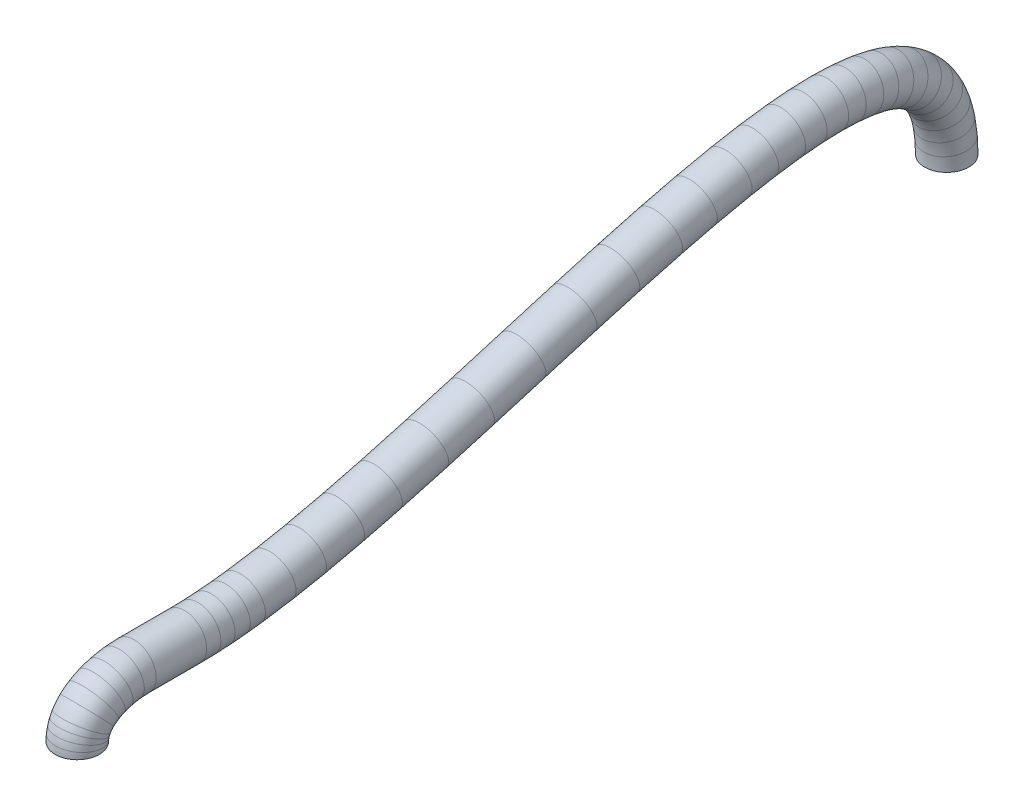
ISO-10303-21;
HEADER;
FILE_DESCRIPTION(('STEP AP214'),'2;1');
FILE_NAME('part.step','',(''),(''),'','','');
FILE_SCHEMA(('AUTOMOTIVE_DESIGN { 1 0 10303 214 1 1 1 1 }'));
ENDSEC;
DATA;
#1=APPLICATION_CONTEXT('core data for automotive mechanical design processes');
#2=APPLICATION_PROTOCOL_DEFINITION('international standard','automotive_design',2000,#1);
#3=PRODUCT_CONTEXT('',#1,'mechanical');
#4=PRODUCT('Part','Part','',(#3));
#5=PRODUCT_RELATED_PRODUCT_CATEGORY('part','',(#4));
#6=PRODUCT_DEFINITION_FORMATION('','',#4);
#7=PRODUCT_DEFINITION_CONTEXT('part definition',#1,'design');
#8=PRODUCT_DEFINITION('design','',#6,#7);
#9=PRODUCT_DEFINITION_SHAPE('','',#8);
#10=(LENGTH_UNIT() NAMED_UNIT(*) SI_UNIT(.MILLI.,.METRE.));
#11=(NAMED_UNIT(*) PLANE_ANGLE_UNIT() SI_UNIT($,.RADIAN.));
#12=(NAMED_UNIT(*) SI_UNIT($,.STERADIAN.) SOLID_ANGLE_UNIT());
#13=UNCERTAINTY_MEASURE_WITH_UNIT(LENGTH_MEASURE(1.E-05),#10,'distance_accuracy_value','');
#14=(GEOMETRIC_REPRESENTATION_CONTEXT(3) GLOBAL_UNCERTAINTY_ASSIGNED_CONTEXT((#13)) GLOBAL_UNIT_ASSIGNED_CONTEXT((#10,
#11,#12)) REPRESENTATION_CONTEXT('',''));
#15=CARTESIAN_POINT('',(0.,0.,0.));
#16=DIRECTION('',(0.,0.,1.));
#17=DIRECTION('',(1.,0.,0.));
#18=AXIS2_PLACEMENT_3D('',#15,#16,#17);
#19=CARTESIAN_POINT('',(-0.599683531625927,128.049999999714,242.874757540876));
#20=DIRECTION('',(0.,1.,0.));
#21=DIRECTION('',(0.,0.,-1.));
#22=AXIS2_PLACEMENT_3D('',#19,#20,#21);
#23=PLANE('',#22);
#24=CARTESIAN_POINT('',(-0.599683531625927,128.049999999714,242.874757540876));
#25=DIRECTION('',(0.,1.,0.));
#26=DIRECTION('',(0.,0.,1.));
#27=AXIS2_PLACEMENT_3D('',#24,#25,#26);
#28=CIRCLE('',#27,1.75);
#29=CARTESIAN_POINT('',(-0.599683531625927,128.049999999714,244.624757540876));
#30=VERTEX_POINT('',#29);
#31=EDGE_CURVE('E11',#30,#30,#28,.T.);
#32=ORIENTED_EDGE('',*,*,#31,.F.);
#33=EDGE_LOOP('',(#32));
#34=FACE_BOUND('',#33,.T.);
#35=ADVANCED_FACE('F43',(#34),#23,.F.);
#36=CARTESIAN_POINT('',(-0.652273653359081,128.049999999718,256.939520418748));
#37=DIRECTION('',(-0.999993009488198,0.,-0.00373911416480584));
#38=DIRECTION('',(0.00373911416480584,0.,-0.999993009488198));
#39=AXIS2_PLACEMENT_3D('',#36,#37,#38);
#40=TOROIDAL_SURFACE('',#39,14.0648611984503,1.75);
#41=ORIENTED_EDGE('',*,*,#31,.T.);
#42=EDGE_LOOP('',(#41));
#43=FACE_BOUND('',#42,.T.);
#44=CARTESIAN_POINT('',(-0.599876661506819,129.254270391039,242.926408419214));
#45=DIRECTION('',(-0.000320152784654025,0.996327639592214,0.0856220303823781));
#46=DIRECTION('',(1.37312788296879E-05,-0.0856220303823781,0.996327690935393));
#47=AXIS2_PLACEMENT_3D('',#44,#45,#46);
#48=CIRCLE('',#47,1.75);
#49=CARTESIAN_POINT('',(-0.599852631768867,129.104431837869,244.66998187835));
#50=VERTEX_POINT('',#49);
#51=EDGE_CURVE('E53',#50,#50,#48,.T.);
#52=ORIENTED_EDGE('',*,*,#51,.F.);
#53=EDGE_LOOP('',(#52));
#54=FACE_BOUND('',#53,.T.);
#55=ADVANCED_FACE('F288',(#43,#54),#40,.T.);
#56=CARTESIAN_POINT('',(-0.637481512230464,128.377168882452,253.132525145626));
#57=DIRECTION('',(0.999993210663899,4.65774382858567E-06,0.00368491579451424));
#58=DIRECTION('',(-0.00368491579455421,0.,0.999993210674746));
#59=AXIS2_PLACEMENT_3D('',#56,#57,#58);
#60=TOROIDAL_SURFACE('',#59,10.2438049480803,1.75);
#61=CARTESIAN_POINT('',(-0.600521501899077,130.446108992095,243.099895351067));
#62=DIRECTION('',(-0.000748803744928628,0.979391732372712,0.201968497179461));
#63=DIRECTION('',(7.66801555379996E-05,-0.201968496973167,0.979392015666124));
#64=AXIS2_PLACEMENT_3D('',#61,#62,#63);
#65=CIRCLE('',#64,1.75);
#66=CARTESIAN_POINT('',(-0.600387311626886,130.092664122392,244.813831378483));
#67=VERTEX_POINT('',#66);
#68=EDGE_CURVE('E207',#67,#67,#65,.T.);
#69=ORIENTED_EDGE('',*,*,#68,.F.);
#70=EDGE_LOOP('',(#69));
#71=FACE_BOUND('',#70,.T.);
#72=ORIENTED_EDGE('',*,*,#51,.T.);
#73=EDGE_LOOP('',(#72));
#74=FACE_BOUND('',#73,.T.);
#75=ADVANCED_FACE('F295',(#71,#74),#60,.T.);
#76=CARTESIAN_POINT('',(-0.631750574027209,128.684244505386,251.643466014292));
#77=DIRECTION('',(0.999993311714176,1.03364423971567E-05,0.00365737885266749));
#78=DIRECTION('',(-0.00365737885286287,0.,0.999993311767597));
#79=AXIS2_PLACEMENT_3D('',#76,#77,#78);
#80=TOROIDAL_SURFACE('',#79,8.7234019397249,1.75);
#81=CARTESIAN_POINT('',(-0.601714966367318,131.603113056252,243.422940140175));
#82=DIRECTION('',(-0.00123350720030742,0.94235950622106,0.334599819926412));
#83=DIRECTION('',(0.000213491057720491,-0.334599818690996,0.942360289779615));
#84=AXIS2_PLACEMENT_3D('',#81,#82,#83);
#85=CIRCLE('',#84,1.75);
#86=CARTESIAN_POINT('',(-0.601341357016307,131.017563373543,245.072070647289));
#87=VERTEX_POINT('',#86);
#88=EDGE_CURVE('E208',#87,#87,#85,.T.);
#89=ORIENTED_EDGE('',*,*,#88,.F.);
#90=EDGE_LOOP('',(#89));
#91=FACE_BOUND('',#90,.T.);
#92=ORIENTED_EDGE('',*,*,#68,.T.);
#93=EDGE_LOOP('',(#92));
#94=FACE_BOUND('',#93,.T.);
#95=ADVANCED_FACE('F324',(#91,#94),#80,.T.);
#96=CARTESIAN_POINT('',(-0.624426582613726,129.355162772898,249.753933697064));
#97=DIRECTION('',(0.999993525080731,3.12614918615267E-05,0.00359844679437807));
#98=DIRECTION('',(-0.00359844679613641,0.,0.999993525569369));
#99=AXIS2_PLACEMENT_3D('',#96,#97,#98);
#100=TOROIDAL_SURFACE('',#99,6.71827922248788,1.75);
#101=CARTESIAN_POINT('',(-0.603550296161902,132.692963501162,243.923502650359));
#102=DIRECTION('',(-0.0018149240154829,0.867851457829194,0.49682044361576));
#103=DIRECTION('',(0.000486673799911577,-0.496820436476968,0.867853223216603));
#104=AXIS2_PLACEMENT_3D('',#101,#102,#103);
#105=CIRCLE('',#104,1.75);
#106=CARTESIAN_POINT('',(-0.602698617012057,131.823527737327,245.442245790988));
#107=VERTEX_POINT('',#106);
#108=EDGE_CURVE('E225',#107,#107,#105,.T.);
#109=ORIENTED_EDGE('',*,*,#108,.F.);
#110=EDGE_LOOP('',(#109));
#111=FACE_BOUND('',#110,.T.);
#112=ORIENTED_EDGE('',*,*,#88,.T.);
#113=EDGE_LOOP('',(#112));
#114=FACE_BOUND('',#113,.T.);
#115=ADVANCED_FACE('F320',(#111,#114),#100,.T.);
#116=CARTESIAN_POINT('',(-0.622465015388532,129.635265783757,249.264653818699));
#117=DIRECTION('',(0.999993630358914,4.81866480562204E-05,0.00356888212852285));
#118=DIRECTION('',(-0.00356888213266624,0.,0.999993631519883));
#119=AXIS2_PLACEMENT_3D('',#116,#117,#118);
#120=TOROIDAL_SURFACE('',#119,6.1544917662376,1.75);
#121=CARTESIAN_POINT('',(-0.605871285255088,133.604911050574,244.561526135503));
#122=DIRECTION('',(-0.00233875103817929,0.764182831932174,0.644995449304647));
#123=DIRECTION('',(0.000863792573269664,-0.644995428858808,0.764185939816765));
#124=AXIS2_PLACEMENT_3D('',#121,#122,#123);
#125=CIRCLE('',#124,1.75);
#126=CARTESIAN_POINT('',(-0.604359648251866,132.476169050071,245.898851530183));
#127=VERTEX_POINT('',#126);
#128=EDGE_CURVE('E223',#127,#127,#125,.T.);
#129=ORIENTED_EDGE('',*,*,#128,.F.);
#130=EDGE_LOOP('',(#129));
#131=FACE_BOUND('',#130,.T.);
#132=ORIENTED_EDGE('',*,*,#108,.T.);
#133=EDGE_LOOP('',(#132));
#134=FACE_BOUND('',#133,.T.);
#135=ADVANCED_FACE('F323',(#131,#134),#120,.T.);
#136=CARTESIAN_POINT('',(-0.621707328334184,129.71731242344,249.16744869657));
#137=DIRECTION('',(0.999993813510165,9.25674170831454E-05,0.00351630099256304));
#138=DIRECTION('',(-0.00351630100762815,0.,0.999993817794502));
#139=AXIS2_PLACEMENT_3D('',#136,#137,#138);
#140=TOROIDAL_SURFACE('',#139,6.02728765735467,1.75);
#141=CARTESIAN_POINT('',(-0.608732601913965,134.385396041345,245.354703819553));
#142=DIRECTION('',(-0.00278190190305762,0.63258419529721,0.774486602132008));
#143=DIRECTION('',(0.00133851675835,-0.774486549690048,0.632588960322651));
#144=AXIS2_PLACEMENT_3D('',#141,#142,#143);
#145=CIRCLE('',#144,1.75);
#146=CARTESIAN_POINT('',(-0.606390197586853,133.030044579388,246.461734500118));
#147=VERTEX_POINT('',#146);
#148=EDGE_CURVE('E137',#147,#147,#145,.T.);
#149=ORIENTED_EDGE('',*,*,#148,.F.);
#150=EDGE_LOOP('',(#149));
#151=FACE_BOUND('',#150,.T.);
#152=ORIENTED_EDGE('',*,*,#128,.T.);
#153=EDGE_LOOP('',(#152));
#154=FACE_BOUND('',#153,.T.);
#155=ADVANCED_FACE('F392',(#151,#154),#140,.T.);
#156=CARTESIAN_POINT('',(-0.622317418503753,129.40318006879,249.424023135722));
#157=DIRECTION('',(0.99999390069249,0.000124234865713663,0.00349043600675036));
#158=DIRECTION('',(-0.00349043603368657,0.,0.999993908409594));
#159=AXIS2_PLACEMENT_3D('',#156,#157,#158);
#160=TOROIDAL_SURFACE('',#159,6.4328858408471,1.75);
#161=CARTESIAN_POINT('',(-0.612087032489747,135.022692494335,246.293049536388));
#162=DIRECTION('',(-0.00310957245162838,0.486716271442068,0.87355457853113));
#163=DIRECTION('',(0.00185996400491503,-0.873554475869836,0.486722835114275));
#164=AXIS2_PLACEMENT_3D('',#161,#162,#163);
#165=CIRCLE('',#164,1.75);
#166=CARTESIAN_POINT('',(-0.608832095481146,133.493972161562,247.144814497838));
#167=VERTEX_POINT('',#166);
#168=EDGE_CURVE('E143',#167,#167,#165,.T.);
#169=ORIENTED_EDGE('',*,*,#168,.F.);
#170=EDGE_LOOP('',(#169));
#171=FACE_BOUND('',#170,.T.);
#172=ORIENTED_EDGE('',*,*,#148,.T.);
#173=EDGE_LOOP('',(#172));
#174=FACE_BOUND('',#173,.T.);
#175=ADVANCED_FACE('F383',(#171,#174),#160,.T.);
#176=CARTESIAN_POINT('',(-0.624180487075606,127.991989632968,250.210286033025));
#177=DIRECTION('',(0.999994036353045,0.000200866190490617,0.00344774000155363));
#178=DIRECTION('',(-0.00344774007110701,0.,0.999994056526539));
#179=AXIS2_PLACEMENT_3D('',#176,#177,#178);
#180=TOROIDAL_SURFACE('',#179,8.04833341425746,1.75);
#181=CARTESIAN_POINT('',(-0.615730840924032,135.504153453692,247.321861881148));
#182=DIRECTION('',(-0.00329014382181626,0.358886232695404,0.933375512286096));
#183=DIRECTION('',(0.00231270218641395,-0.933375337238741,0.358894317652236));
#184=AXIS2_PLACEMENT_3D('',#181,#182,#183);
#185=CIRCLE('',#184,1.75);
#186=CARTESIAN_POINT('',(-0.611683612097808,133.870746613524,247.94992693704));
#187=VERTEX_POINT('',#186);
#188=EDGE_CURVE('E199',#187,#187,#185,.T.);
#189=ORIENTED_EDGE('',*,*,#188,.F.);
#190=EDGE_LOOP('',(#189));
#191=FACE_BOUND('',#190,.T.);
#192=ORIENTED_EDGE('',*,*,#168,.T.);
#193=EDGE_LOOP('',(#192));
#194=FACE_BOUND('',#193,.T.);
#195=ADVANCED_FACE('F307',(#191,#194),#180,.T.);
#196=CARTESIAN_POINT('',(-0.625100312491796,126.750065899135,250.687806921357));
#197=DIRECTION('',(0.999994088463878,0.000248345596694913,0.00342948418323945));
#198=DIRECTION('',(-0.00342948428899709,0.,0.999994119301464));
#199=AXIS2_PLACEMENT_3D('',#196,#197,#198);
#200=TOROIDAL_SURFACE('',#199,9.37889773446503,1.75);
#201=CARTESIAN_POINT('',(-0.619674931684227,135.857180625359,248.446344309092));
#202=DIRECTION('',(-0.00338945622166507,0.238990554273646,0.971015976467173));
#203=DIRECTION('',(0.00273322805667371,-0.971015713086341,0.239000030133502));
#204=AXIS2_PLACEMENT_3D('',#201,#202,#203);
#205=CIRCLE('',#204,1.75);
#206=CARTESIAN_POINT('',(-0.614891782585048,134.157903127458,248.864594361826));
#207=VERTEX_POINT('',#206);
#208=EDGE_CURVE('E213',#207,#207,#205,.T.);
#209=ORIENTED_EDGE('',*,*,#208,.F.);
#210=EDGE_LOOP('',(#209));
#211=FACE_BOUND('',#210,.T.);
#212=ORIENTED_EDGE('',*,*,#188,.T.);
#213=EDGE_LOOP('',(#212));
#214=FACE_BOUND('',#213,.T.);
#215=ADVANCED_FACE('F248',(#211,#214),#200,.T.);
#216=CARTESIAN_POINT('',(-0.625631100477509,123.344005120613,251.526119136599));
#217=DIRECTION('',(0.999994148962456,0.000361245385868,0.00340169702135095));
#218=DIRECTION('',(-0.00340169724330869,0.,0.999994214211195));
#219=AXIS2_PLACEMENT_3D('',#216,#217,#218);
#220=TOROIDAL_SURFACE('',#219,12.8866058245246,1.75);
#221=CARTESIAN_POINT('',(-0.623694234671559,136.086389186438,249.60355463983));
#222=DIRECTION('',(-0.00341752111260348,0.149190552002641,0.988802558523486));
#223=DIRECTION('',(0.00304512418523937,-0.98880219573266,0.14920102188982));
#224=AXIS2_PLACEMENT_3D('',#221,#222,#223);
#225=CIRCLE('',#224,1.75);
#226=CARTESIAN_POINT('',(-0.61836526734739,134.355985343906,249.864656428137));
#227=VERTEX_POINT('',#226);
#228=EDGE_CURVE('E210',#227,#227,#225,.T.);
#229=ORIENTED_EDGE('',*,*,#228,.F.);
#230=EDGE_LOOP('',(#229));
#231=FACE_BOUND('',#230,.T.);
#232=ORIENTED_EDGE('',*,*,#208,.T.);
#233=EDGE_LOOP('',(#232));
#234=FACE_BOUND('',#233,.T.);
#235=ADVANCED_FACE('F242',(#231,#234),#220,.T.);
#236=CARTESIAN_POINT('',(-0.624924808057016,120.98128654175,251.882608609387));
#237=DIRECTION('',(0.999994157013046,0.000430210280331358,0.00339129162436649));
#238=DIRECTION('',(-0.00339129193819816,0.,0.999994249552961));
#239=AXIS2_PLACEMENT_3D('',#236,#237,#238);
#240=TOROIDAL_SURFACE('',#239,15.2760667194476,1.75);
#241=CARTESIAN_POINT('',(-0.628401088826437,136.230260706293,250.973219110007));
#242=DIRECTION('',(-0.00341088763441394,0.0595292239451879,0.998220735780433));
#243=DIRECTION('',(0.00335324218762274,-0.998220249455797,0.0595406528620355));
#244=AXIS2_PLACEMENT_3D('',#241,#242,#243);
#245=CIRCLE('',#244,1.75);
#246=CARTESIAN_POINT('',(-0.622532914998097,134.483375269746,251.077415252515));
#247=VERTEX_POINT('',#246);
#248=EDGE_CURVE('E214',#247,#247,#245,.T.);
#249=ORIENTED_EDGE('',*,*,#248,.F.);
#250=EDGE_LOOP('',(#249));
#251=FACE_BOUND('',#250,.T.);
#252=ORIENTED_EDGE('',*,*,#228,.T.);
#253=EDGE_LOOP('',(#252));
#254=FACE_BOUND('',#253,.T.);
#255=ADVANCED_FACE('F239',(#251,#254),#240,.T.);
#256=CARTESIAN_POINT('',(-0.619666539561834,114.647987198223,252.260314979114));
#257=DIRECTION('',(0.999994101300764,0.000606326155324328,0.00338078870550778));
#258=DIRECTION('',(-0.00338078932695,0.,0.999994285115434));
#259=AXIS2_PLACEMENT_3D('',#256,#257,#258);
#260=TOROIDAL_SURFACE('',#259,21.6206202928078,1.75);
#261=CARTESIAN_POINT('',(-0.633080857270421,136.268414852337,252.350592080749));
#262=DIRECTION('',(-0.0033782268623258,-0.00417758227444612,0.999985567590656));
#263=DIRECTION('',(0.00356969056087941,-0.999984952761725,-0.00416552030732148));
#264=AXIS2_PLACEMENT_3D('',#261,#262,#263);
#265=CIRCLE('',#264,1.75);
#266=CARTESIAN_POINT('',(-0.626833898788882,134.518441185004,252.343302420211));
#267=VERTEX_POINT('',#266);
#268=EDGE_CURVE('E193',#267,#267,#265,.T.);
#269=ORIENTED_EDGE('',*,*,#268,.F.);
#270=EDGE_LOOP('',(#269));
#271=FACE_BOUND('',#270,.T.);
#272=ORIENTED_EDGE('',*,*,#248,.T.);
#273=EDGE_LOOP('',(#272));
#274=FACE_BOUND('',#273,.T.);
#275=ADVANCED_FACE('F237',(#271,#274),#260,.T.);
#276=CARTESIAN_POINT('',(-0.614231723329741,110.487293714002,252.242951449205));
#277=DIRECTION('',(0.999994026509214,0.000716999903687829,0.00338125080820345));
#278=DIRECTION('',(-0.00338125167733548,0.,0.999994283552208));
#279=AXIS2_PLACEMENT_3D('',#276,#277,#278);
#280=TOROIDAL_SURFACE('',#279,25.7813527369083,1.75);
#281=CARTESIAN_POINT('',(-0.638800202803894,136.204836849272,254.055551907184));
#282=DIRECTION('',(-0.00332247225471219,-0.0703094488919252,0.997519695331691));
#283=DIRECTION('',(0.00379153006440051,-0.997518916647569,-0.0702967654307839));
#284=AXIS2_PLACEMENT_3D('',#281,#282,#283);
#285=CIRCLE('',#284,1.75);
#286=CARTESIAN_POINT('',(-0.632165025191193,134.459178745139,253.932532567681));
#287=VERTEX_POINT('',#286);
#288=EDGE_CURVE('E190',#287,#287,#285,.T.);
#289=ORIENTED_EDGE('',*,*,#288,.F.);
#290=EDGE_LOOP('',(#289));
#291=FACE_BOUND('',#290,.T.);
#292=ORIENTED_EDGE('',*,*,#268,.T.);
#293=EDGE_LOOP('',(#292));
#294=FACE_BOUND('',#293,.T.);
#295=ADVANCED_FACE('F304',(#291,#294),#280,.T.);
#296=CARTESIAN_POINT('',(-0.592317097737333,99.2105248466977,251.448189604069));
#297=DIRECTION('',(0.999993695084569,0.00101668584303605,0.00340237284938798));
#298=DIRECTION('',(-0.00340237460782086,0.,0.999994211906763));
#299=AXIS2_PLACEMENT_3D('',#296,#297,#298);
#300=TOROIDAL_SURFACE('',#299,37.0861108691996,1.75);
#301=CARTESIAN_POINT('',(-0.644419738438305,136.045704877715,255.754744700652));
#302=DIRECTION('',(-0.00326129108731504,-0.116127173105423,0.99322899859347));
#303=DIRECTION('',(0.00394305626656437,-0.993228052622251,-0.116114115384353));
#304=AXIS2_PLACEMENT_3D('',#301,#302,#303);
#305=CIRCLE('',#304,1.75);
#306=CARTESIAN_POINT('',(-0.637519389971817,134.307555785626,255.551544998729));
#307=VERTEX_POINT('',#306);
#308=EDGE_CURVE('E187',#307,#307,#305,.T.);
#309=ORIENTED_EDGE('',*,*,#308,.F.);
#310=EDGE_LOOP('',(#309));
#311=FACE_BOUND('',#310,.T.);
#312=ORIENTED_EDGE('',*,*,#288,.T.);
#313=EDGE_LOOP('',(#312));
#314=FACE_BOUND('',#313,.T.);
#315=ADVANCED_FACE('F301',(#311,#314),#300,.T.);
#316=CARTESIAN_POINT('',(-0.573058372761235,91.842307760365,250.5867695147));
#317=DIRECTION('',(0.999993396421797,0.00121389673854435,0.0034254295360203));
#318=DIRECTION('',(-0.00342543205978587,0.,0.999994133190392));
#319=AXIS2_PLACEMENT_3D('',#316,#317,#318);
#320=TOROIDAL_SURFACE('',#319,44.504532091477,1.75);
#321=CARTESIAN_POINT('',(-0.651354979313449,135.744069832681,257.886258076816));
#322=DIRECTION('',(-0.00317993607564097,-0.164021689833451,0.986451607161109));
#323=DIRECTION('',(0.0040988880789254,-0.986450445818738,-0.16400828351193));
#324=AXIS2_PLACEMENT_3D('',#321,#322,#323);
#325=CIRCLE('',#324,1.75);
#326=CARTESIAN_POINT('',(-0.64418192517533,134.017781552498,257.599243580671));
#327=VERTEX_POINT('',#326);
#328=EDGE_CURVE('E191',#327,#327,#325,.T.);
#329=ORIENTED_EDGE('',*,*,#328,.F.);
#330=EDGE_LOOP('',(#329));
#331=FACE_BOUND('',#330,.T.);
#332=ORIENTED_EDGE('',*,*,#308,.T.);
#333=EDGE_LOOP('',(#332));
#334=FACE_BOUND('',#333,.T.);
#335=ADVANCED_FACE('F188',(#331,#334),#320,.T.);
#336=CARTESIAN_POINT('',(-0.498285050321519,71.2133878518039,247.156948422644));
#337=DIRECTION('',(0.999992206360794,0.00178666119663753,0.00352066178998288));
#338=DIRECTION('',(-0.00352066740925109,0.,0.999993802431292));
#339=AXIS2_PLACEMENT_3D('',#336,#337,#338);
#340=TOROIDAL_SURFACE('',#339,65.4167442859653,1.75);
#341=CARTESIAN_POINT('',(-0.658117860447412,135.356009454195,260.004087420128));
#342=DIRECTION('',(-0.00310120894068885,-0.19639622437575,0.980519711966086));
#343=DIRECTION('',(0.00420226941875658,-0.980518328860248,-0.196382656313737));
#344=AXIS2_PLACEMENT_3D('',#341,#342,#343);
#345=CIRCLE('',#344,1.75);
#346=CARTESIAN_POINT('',(-0.650763888964588,133.64010237869,259.660417771579));
#347=VERTEX_POINT('',#346);
#348=EDGE_CURVE('E195',#347,#347,#345,.T.);
#349=ORIENTED_EDGE('',*,*,#348,.F.);
#350=EDGE_LOOP('',(#349));
#351=FACE_BOUND('',#350,.T.);
#352=ORIENTED_EDGE('',*,*,#328,.T.);
#353=EDGE_LOOP('',(#352));
#354=FACE_BOUND('',#353,.T.);
#355=ADVANCED_FACE('F344',(#351,#354),#340,.T.);
#356=CARTESIAN_POINT('',(-0.428217155687766,56.8235498881942,244.274912992158));
#357=DIRECTION('',(0.999991071498182,0.00220548413444708,0.00360454763461999));
#358=DIRECTION('',(-0.00360455640120066,0.,0.999993503565473));
#359=AXIS2_PLACEMENT_3D('',#356,#357,#358);
#360=TOROIDAL_SURFACE('',#359,80.0924902097886,1.75);
#361=CARTESIAN_POINT('',(-0.666730879111,134.752696931439,262.762696534843));
#362=DIRECTION('',(-0.0029980939377611,-0.230839098149267,0.97298731862156));
#363=DIRECTION('',(0.00430980772855445,-0.97298563776655,-0.23082541943504));
#364=AXIS2_PLACEMENT_3D('',#361,#362,#363);
#365=CIRCLE('',#364,1.75);
#366=CARTESIAN_POINT('',(-0.65918871558603,133.049972065348,262.358752050832));
#367=VERTEX_POINT('',#366);
#368=EDGE_CURVE('E204',#367,#367,#365,.T.);
#369=ORIENTED_EDGE('',*,*,#368,.F.);
#370=EDGE_LOOP('',(#369));
#371=FACE_BOUND('',#370,.T.);
#372=ORIENTED_EDGE('',*,*,#348,.T.);
#373=EDGE_LOOP('',(#372));
#374=FACE_BOUND('',#373,.T.);
#375=ADVANCED_FACE('F347',(#371,#374),#360,.T.);
#376=CARTESIAN_POINT('',(-0.102380615885554,11.2035963340178,233.452683507836));
#377=DIRECTION('',(0.99998562916645,0.00363233224022014,0.00394304743519032));
#378=DIRECTION('',(-0.00394307344741129,0.,0.999992226055677));
#379=AXIS2_PLACEMENT_3D('',#376,#377,#378);
#380=TOROIDAL_SURFACE('',#379,126.979429882539,1.75);
#381=CARTESIAN_POINT('',(-0.675057663407995,134.070270945243,265.503080139907));
#382=DIRECTION('',(-0.00289851228295659,-0.252420365752298,0.96761333061302));
#383=DIRECTION('',(0.00437538357992854,-0.967611334380205,-0.252406738415376));
#384=AXIS2_PLACEMENT_3D('',#381,#382,#383);
#385=CIRCLE('',#384,1.75);
#386=CARTESIAN_POINT('',(-0.66740074214312,132.376951110078,265.06136834768));
#387=VERTEX_POINT('',#386);
#388=EDGE_CURVE('E206',#387,#387,#385,.T.);
#389=ORIENTED_EDGE('',*,*,#388,.F.);
#390=EDGE_LOOP('',(#389));
#391=FACE_BOUND('',#390,.T.);
#392=ORIENTED_EDGE('',*,*,#368,.T.);
#393=EDGE_LOOP('',(#392));
#394=FACE_BOUND('',#393,.T.);
#395=ADVANCED_FACE('F388',(#391,#394),#380,.T.);
#396=CARTESIAN_POINT('',(0.275809855798284,-25.17131377454,223.9647283158));
#397=DIRECTION('',(0.999979107659913,0.00485908028752361,0.00426304849173148));
#398=DIRECTION('',(0.00485912444157354,-0.999988194385145,0.));
#399=AXIS2_PLACEMENT_3D('',#396,#397,#398);
#400=TOROIDAL_SURFACE('',#399,164.572844434829,1.75);
#401=CARTESIAN_POINT('',(-0.685040802635149,133.145529051882,268.898848634958));
#402=DIRECTION('',(-0.00277429658164071,-0.273054025696414,0.961994699740835));
#403=DIRECTION('',(0.00443604443466403,-0.961992296882615,-0.273040550556661));
#404=AXIS2_PLACEMENT_3D('',#401,#402,#403);
#405=CIRCLE('',#404,1.75);
#406=CARTESIAN_POINT('',(-0.677277724874487,131.462042532337,268.421027671483));
#407=VERTEX_POINT('',#406);
#408=EDGE_CURVE('E258',#407,#407,#405,.T.);
#409=ORIENTED_EDGE('',*,*,#408,.F.);
#410=EDGE_LOOP('',(#409));
#411=FACE_BOUND('',#410,.T.);
#412=ORIENTED_EDGE('',*,*,#388,.T.);
#413=EDGE_LOOP('',(#412));
#414=FACE_BOUND('',#413,.T.);
#415=ADVANCED_FACE('F385',(#411,#414),#400,.T.);
#416=CARTESIAN_POINT('',(3.44396475529834,-191.97275807987,176.628691568451));
#417=DIRECTION('',(0.999921525959788,0.0109949111489383,0.00600448591278886));
#418=DIRECTION('',(0.0109951093587426,-0.999939551958112,0.));
#419=AXIS2_PLACEMENT_3D('',#416,#417,#418);
#420=TOROIDAL_SURFACE('',#419,337.983329765626,1.75);
#421=CARTESIAN_POINT('',(-0.69458120167335,132.166873463556,272.279634583736));
#422=DIRECTION('',(-0.00264693004896623,-0.283056228859476,0.959099663781178));
#423=DIRECTION('',(0.00446427100503672,-0.959096810988953,-0.283043066396642));
#424=AXIS2_PLACEMENT_3D('',#421,#422,#423);
#425=CIRCLE('',#424,1.75);
#426=CARTESIAN_POINT('',(-0.686768727414536,130.488454044326,271.784309217541));
#427=VERTEX_POINT('',#426);
#428=EDGE_CURVE('E260',#427,#427,#425,.T.);
#429=ORIENTED_EDGE('',*,*,#428,.F.);
#430=EDGE_LOOP('',(#429));
#431=FACE_BOUND('',#430,.T.);
#432=ORIENTED_EDGE('',*,*,#408,.T.);
#433=EDGE_LOOP('',(#432));
#434=FACE_BOUND('',#433,.T.);
#435=ADVANCED_FACE('F342',(#431,#434),#420,.T.);
#436=CARTESIAN_POINT('',(13.5183888657127,-458.229602431374,98.0769051164684));
#437=DIRECTION('',(0.999730040402079,0.0213903351987662,0.00907192800578628));
#438=DIRECTION('',(0.0213912154640868,-0.999771181771594,0.));
#439=AXIS2_PLACEMENT_3D('',#436,#437,#438);
#440=TOROIDAL_SURFACE('',#439,615.724449913381,1.75);
#441=CARTESIAN_POINT('',(-0.705425606838295,130.957557541384,276.326089816486));
#442=DIRECTION('',(-0.00248853799422287,-0.289626475068723,0.957136516970237));
#443=DIRECTION('',(0.00448188038385122,-0.957133097732603,-0.289613787608628));
#444=AXIS2_PLACEMENT_3D('',#441,#442,#443);
#445=CIRCLE('',#444,1.75);
#446=CARTESIAN_POINT('',(-0.697582316166556,129.282574620352,275.819265688171));
#447=VERTEX_POINT('',#446);
#448=EDGE_CURVE('E587',#447,#447,#445,.T.);
#449=ORIENTED_EDGE('',*,*,#448,.F.);
#450=EDGE_LOOP('',(#449));
#451=FACE_BOUND('',#450,.T.);
#452=ORIENTED_EDGE('',*,*,#428,.T.);
#453=EDGE_LOOP('',(#452));
#454=FACE_BOUND('',#453,.T.);
#455=ADVANCED_FACE('F339',(#451,#454),#440,.T.);
#456=CARTESIAN_POINT('',(35.6085303581622,1011.35780378779,542.826828329937));
#457=DIRECTION('',(-0.999218552525222,0.0384768970198325,0.00904503649108143));
#458=DIRECTION('',(0.038478471065546,0.999259429409829,0.));
#459=AXIS2_PLACEMENT_3D('',#456,#457,#458);
#460=TOROIDAL_SURFACE('',#459,920.568270481217,1.75);
#461=CARTESIAN_POINT('',(-0.715553329222645,129.743638914068,280.371182829492));
#462=DIRECTION('',(-0.00230753831074339,-0.28523588231284,0.958454572062839));
#463=DIRECTION('',(0.0044708894040993,-0.958450487225248,-0.285223902724895));
#464=AXIS2_PLACEMENT_3D('',#461,#462,#463);
#465=CIRCLE('',#464,1.75);
#466=CARTESIAN_POINT('',(-0.707729272765471,128.066350561424,279.872040999723));
#467=VERTEX_POINT('',#466);
#468=EDGE_CURVE('E589',#467,#467,#465,.T.);
#469=ORIENTED_EDGE('',*,*,#468,.F.);
#470=EDGE_LOOP('',(#469));
#471=FACE_BOUND('',#470,.T.);
#472=ORIENTED_EDGE('',*,*,#448,.T.);
#473=EDGE_LOOP('',(#472));
#474=FACE_BOUND('',#473,.T.);
#475=ADVANCED_FACE('F45',(#471,#474),#460,.T.);
#476=CARTESIAN_POINT('',(7.79880427726443,538.652471549426,402.082865645334));
#477=DIRECTION('',(-0.999798258505332,0.0197820976124579,0.00348007237817445));
#478=DIRECTION('',(0.0197822174030861,0.999804312790567,0.));
#479=AXIS2_PLACEMENT_3D('',#476,#477,#478);
#480=TOROIDAL_SURFACE('',#479,426.723167201555,1.75);
#481=CARTESIAN_POINT('',(-0.723944393135597,128.681149489532,284.000101153262));
#482=DIRECTION('',(-0.00213064339992364,-0.276733515209937,0.960944338616058));
#483=DIRECTION('',(0.00445123131737502,-0.960939624415454,-0.276722288166394));
#484=AXIS2_PLACEMENT_3D('',#481,#482,#483);
#485=CIRCLE('',#484,1.75);
#486=CARTESIAN_POINT('',(-0.716154738330191,126.999505146805,283.51583714897));
#487=VERTEX_POINT('',#486);
#488=EDGE_CURVE('E232',#487,#487,#485,.T.);
#489=ORIENTED_EDGE('',*,*,#488,.F.);
#490=EDGE_LOOP('',(#489));
#491=FACE_BOUND('',#490,.T.);
#492=ORIENTED_EDGE('',*,*,#468,.T.);
#493=EDGE_LOOP('',(#492));
#494=FACE_BOUND('',#493,.T.);
#495=ADVANCED_FACE('F331',(#491,#494),#480,.T.);
#496=CARTESIAN_POINT('',(1.44541849030038,314.223848615926,337.437645270985));
#497=DIRECTION('',(-0.999934620058354,0.0113854473063844,0.00106169599606506));
#498=DIRECTION('',(0.0113854537232188,0.999935183621177,0.));
#499=AXIS2_PLACEMENT_3D('',#496,#497,#498);
#500=TOROIDAL_SURFACE('',#499,193.096790381822,1.75);
#501=CARTESIAN_POINT('',(-0.731584332556731,127.670407218172,287.643623369499));
#502=DIRECTION('',(-0.00191025531816929,-0.25786590024611,0.966178828382657));
#503=DIRECTION('',(0.00441167084872726,-0.966173361979719,-0.257855718883895));
#504=AXIS2_PLACEMENT_3D('',#501,#502,#503);
#505=CIRCLE('',#504,1.75);
#506=CARTESIAN_POINT('',(-0.723863908571458,125.979603834708,287.192375861453));
#507=VERTEX_POINT('',#506);
#508=EDGE_CURVE('E221',#507,#507,#505,.T.);
#509=ORIENTED_EDGE('',*,*,#508,.F.);
#510=EDGE_LOOP('',(#509));
#511=FACE_BOUND('',#510,.T.);
#512=ORIENTED_EDGE('',*,*,#488,.T.);
#513=EDGE_LOOP('',(#512));
#514=FACE_BOUND('',#513,.T.);
#515=ADVANCED_FACE('F334',(#511,#514),#500,.T.);
#516=CARTESIAN_POINT('',(0.715875991559187,271.035424227778,325.909535546135));
#517=DIRECTION('',(-0.999950600432144,0.00991706168996644,0.000669763266475202));
#518=DIRECTION('',(0.00991706391427901,0.999950824712556,0.));
#519=AXIS2_PLACEMENT_3D('',#516,#517,#518);
#520=TOROIDAL_SURFACE('',#519,148.391048511237,1.75);
#521=CARTESIAN_POINT('',(-0.737153798764787,126.907384882624,290.626391451335));
#522=DIRECTION('',(-0.00170747125735028,-0.237766190498944,0.971320916688983));
#523=DIRECTION('',(0.00437414225500641,-0.97131481614445,-0.237757007925752));
#524=AXIS2_PLACEMENT_3D('',#521,#522,#523);
#525=CIRCLE('',#524,1.75);
#526=CARTESIAN_POINT('',(-0.729499049818526,125.207583954371,290.210316687465));
#527=VERTEX_POINT('',#526);
#528=EDGE_CURVE('E219',#527,#527,#525,.T.);
#529=ORIENTED_EDGE('',*,*,#528,.F.);
#530=EDGE_LOOP('',(#529));
#531=FACE_BOUND('',#530,.T.);
#532=ORIENTED_EDGE('',*,*,#508,.T.);
#533=EDGE_LOOP('',(#532));
#534=FACE_BOUND('',#533,.T.);
#535=ADVANCED_FACE('F402',(#531,#534),#520,.T.);
#536=CARTESIAN_POINT('',(0.031471869004618,218.887684946144,313.143272924269));
#537=DIRECTION('',(-0.999965603065638,0.00828969473064047,0.000271379526992458));
#538=DIRECTION('',(0.00828969503589542,0.999965639887797,0.));
#539=AXIS2_PLACEMENT_3D('',#536,#537,#538);
#540=TOROIDAL_SURFACE('',#539,94.6993998738033,1.75);
#541=CARTESIAN_POINT('',(-0.742003536672188,126.224103256068,293.62818387446));
#542=DIRECTION('',(-0.00144274548812183,-0.206069180184727,0.978536361850417));
#543=DIRECTION('',(0.00432293433189368,-0.978529522106939,-0.206061366111963));
#544=AXIS2_PLACEMENT_3D('',#541,#542,#543);
#545=CIRCLE('',#544,1.75);
#546=CARTESIAN_POINT('',(-0.734438401591374,124.511676592381,293.267576483765));
#547=VERTEX_POINT('',#546);
#548=EDGE_CURVE('E222',#547,#547,#545,.T.);
#549=ORIENTED_EDGE('',*,*,#548,.F.);
#550=EDGE_LOOP('',(#549));
#551=FACE_BOUND('',#550,.T.);
#552=ORIENTED_EDGE('',*,*,#528,.T.);
#553=EDGE_LOOP('',(#552));
#554=FACE_BOUND('',#553,.T.);
#555=ADVANCED_FACE('F299',(#551,#554),#540,.T.);
#556=CARTESIAN_POINT('',(-0.142820268216361,202.479575216028,309.687645406001));
#557=DIRECTION('',(-0.999969400813684,0.00782097325706333,0.000172666251998598));
#558=DIRECTION('',(0.00782097337364915,0.999969415720045,0.));
#559=AXIS2_PLACEMENT_3D('',#556,#557,#558);
#560=TOROIDAL_SURFACE('',#559,77.9304967846894,1.75);
#561=CARTESIAN_POINT('',(-0.745229663715975,125.758740044837,296.02335315709));
#562=DIRECTION('',(-0.00120133925816972,-0.175335442634285,0.984508018931398));
#563=DIRECTION('',(0.00428153982724612,-0.984500607358277,-0.175328898153987));
#564=AXIS2_PLACEMENT_3D('',#561,#562,#563);
#565=CIRCLE('',#564,1.75);
#566=CARTESIAN_POINT('',(-0.737736969018294,124.03586398196,295.716527585321));
#567=VERTEX_POINT('',#566);
#568=EDGE_CURVE('E256',#567,#567,#565,.T.);
#569=ORIENTED_EDGE('',*,*,#568,.F.);
#570=EDGE_LOOP('',(#569));
#571=FACE_BOUND('',#570,.T.);
#572=ORIENTED_EDGE('',*,*,#548,.T.);
#573=EDGE_LOOP('',(#572));
#574=FACE_BOUND('',#573,.T.);
#575=ADVANCED_FACE('F361',(#571,#574),#560,.T.);
#576=CARTESIAN_POINT('',(-0.363758998177284,178.763137843072,305.463609251008));
#577=DIRECTION('',(-0.99997417743494,0.00718616105393739,5.96038748244959E-05));
#578=DIRECTION('',(0.00718616106670224,0.999974179211205,0.));
#579=AXIS2_PLACEMENT_3D('',#576,#577,#578);
#580=TOROIDAL_SURFACE('',#579,53.8398564349954,1.75);
#581=CARTESIAN_POINT('',(-0.747768112027033,125.385511202638,298.434267021759));
#582=DIRECTION('',(-0.000879134439053592,-0.13055725010146,0.991440382256333));
#583=DIRECTION('',(0.00423439474758089,-0.991432363038367,-0.130552439354004));
#584=AXIS2_PLACEMENT_3D('',#581,#582,#583);
#585=CIRCLE('',#584,1.75);
#586=CARTESIAN_POINT('',(-0.740357921218766,123.650504567321,298.205800252889));
#587=VERTEX_POINT('',#586);
#588=EDGE_CURVE('E591',#587,#587,#585,.T.);
#589=ORIENTED_EDGE('',*,*,#588,.F.);
#590=EDGE_LOOP('',(#589));
#591=FACE_BOUND('',#590,.T.);
#592=ORIENTED_EDGE('',*,*,#568,.T.);
#593=EDGE_LOOP('',(#592));
#594=FACE_BOUND('',#593,.T.);
#595=ADVANCED_FACE('F318',(#591,#594),#580,.T.);
#596=CARTESIAN_POINT('',(-0.424954868507177,171.462248299276,304.502141593831));
#597=DIRECTION('',(-0.99997549082571,0.00700117888509348,3.52434408930291E-05));
#598=DIRECTION('',(0.00700117888944157,0.999975491446745,0.));
#599=AXIS2_PLACEMENT_3D('',#596,#597,#598);
#600=TOROIDAL_SURFACE('',#599,46.4756819388936,1.75);
#601=CARTESIAN_POINT('',(-0.748716377221162,125.244065050011,299.627336232785));
#602=DIRECTION('',(-0.000699301122593712,-0.10488705255528,0.994483894884279));
#603=DIRECTION('',(0.00421399255252267,-0.994475617197651,-0.104883216322341));
#604=AXIS2_PLACEMENT_3D('',#601,#602,#603);
#605=CIRCLE('',#604,1.75);
#606=CARTESIAN_POINT('',(-0.741341890254247,123.503732719915,299.44379060422));
#607=VERTEX_POINT('',#606);
#608=EDGE_CURVE('E582',#607,#607,#605,.T.);
#609=ORIENTED_EDGE('',*,*,#608,.F.);
#610=EDGE_LOOP('',(#609));
#611=FACE_BOUND('',#610,.T.);
#612=ORIENTED_EDGE('',*,*,#588,.T.);
#613=EDGE_LOOP('',(#612));
#614=FACE_BOUND('',#613,.T.);
#615=ADVANCED_FACE('F314',(#611,#614),#600,.T.);
#616=CARTESIAN_POINT('',(-0.492426596342074,162.978820092285,303.6073569042));
#617=DIRECTION('',(-0.999976945238763,0.00679034769281514,1.3006299063893E-05));
#618=DIRECTION('',(0.00679034769338948,0.999976945323342,0.));
#619=AXIS2_PLACEMENT_3D('',#616,#617,#618);
#620=TOROIDAL_SURFACE('',#619,37.9449336156634,1.75);
#621=CARTESIAN_POINT('',(-0.749427939781827,125.136985201482,300.823929250428));
#622=DIRECTION('',(-0.000485130887604075,-0.0733527920570977,0.997305937285771));
#623=DIRECTION('',(0.00419524117542416,-0.997297427577247,-0.073350125421058));
#624=AXIS2_PLACEMENT_3D('',#621,#622,#623);
#625=CIRCLE('',#624,1.75);
#626=CARTESIAN_POINT('',(-0.742086267724835,123.391714703222,300.695566530942));
#627=VERTEX_POINT('',#626);
#628=EDGE_CURVE('E580',#627,#627,#625,.T.);
#629=ORIENTED_EDGE('',*,*,#628,.F.);
#630=EDGE_LOOP('',(#629));
#631=FACE_BOUND('',#630,.T.);
#632=ORIENTED_EDGE('',*,*,#608,.T.);
#633=EDGE_LOOP('',(#632));
#634=FACE_BOUND('',#633,.T.);
#635=ADVANCED_FACE('F317',(#631,#634),#620,.T.);
#636=CARTESIAN_POINT('',(-0.520433086114378,159.309328469714,303.337448711854));
#637=DIRECTION('',(-0.999977551017322,0.006700553739807,6.40157447671068E-06));
#638=DIRECTION('',(0.00670055373994429,0.999977551037811,0.));
#639=AXIS2_PLACEMENT_3D('',#636,#637,#638);
#640=TOROIDAL_SURFACE('',#639,34.2654237266635,1.75);
#641=CARTESIAN_POINT('',(-0.749850611356014,125.072832048289,301.948584588654));
#642=DIRECTION('',(-0.000265194187744621,-0.0405316573434782,0.999178219550964));
#643=DIRECTION('',(0.00418290668427711,-0.999169558443014,-0.040530195810819));
#644=AXIS2_PLACEMENT_3D('',#641,#642,#643);
#645=CIRCLE('',#644,1.75);
#646=CARTESIAN_POINT('',(-0.742530524658529,123.324285321014,301.877656745985));
#647=VERTEX_POINT('',#646);
#648=EDGE_CURVE('E234',#647,#647,#645,.T.);
#649=ORIENTED_EDGE('',*,*,#648,.F.);
#650=EDGE_LOOP('',(#649));
#651=FACE_BOUND('',#650,.T.);
#652=ORIENTED_EDGE('',*,*,#628,.T.);
#653=EDGE_LOOP('',(#652));
#654=FACE_BOUND('',#653,.T.);
#655=ADVANCED_FACE('F354',(#651,#654),#640,.T.);
#656=CARTESIAN_POINT('',(-0.568213437478557,152.833831469225,303.074757540756));
#657=DIRECTION('',(-0.999978595980468,0.006542750257574,0.));
#658=DIRECTION('',(0.006542750257574,0.999978595980468,0.));
#659=AXIS2_PLACEMENT_3D('',#656,#657,#658);
#660=TOROIDAL_SURFACE('',#659,27.7844263289739,1.75);
#661=CARTESIAN_POINT('',(-0.749999999998997,125.049999838655,303.074757540732));
#662=DIRECTION('',(0.,0.,1.));
#663=DIRECTION('',(0.00417753028899021,-0.999991274082272,0.));
#664=AXIS2_PLACEMENT_3D('',#661,#662,#663);
#665=CIRCLE('',#664,1.75);
#666=CARTESIAN_POINT('',(-0.742689321993264,123.300015109011,303.074757540732));
#667=VERTEX_POINT('',#666);
#668=EDGE_CURVE('E203',#667,#667,#665,.T.);
#669=ORIENTED_EDGE('',*,*,#668,.F.);
#670=EDGE_LOOP('',(#669));
#671=FACE_BOUND('',#670,.T.);
#672=ORIENTED_EDGE('',*,*,#648,.T.);
#673=EDGE_LOOP('',(#672));
#674=FACE_BOUND('',#673,.T.);
#675=ADVANCED_FACE('F282',(#671,#674),#660,.T.);
#676=CARTESIAN_POINT('',(-0.749999999998747,122.049999838663,311.574757540734));
#677=DIRECTION('',(0.,-1.,0.));
#678=DIRECTION('',(0.,0.,-1.));
#679=AXIS2_PLACEMENT_3D('',#676,#677,#678);
#680=PLANE('',#679);
#681=CARTESIAN_POINT('',(-0.749999999998747,122.049999838663,311.574757540734));
#682=DIRECTION('',(0.,-1.,0.));
#683=DIRECTION('',(-1.,0.,0.));
#684=AXIS2_PLACEMENT_3D('',#681,#682,#683);
#685=CIRCLE('',#684,1.75);
#686=CARTESIAN_POINT('',(-2.49999999999875,122.049999838663,311.574757540734));
#687=VERTEX_POINT('',#686);
#688=EDGE_CURVE('E217',#687,#687,#685,.T.);
#689=ORIENTED_EDGE('',*,*,#688,.T.);
#690=EDGE_LOOP('',(#689));
#691=FACE_BOUND('',#690,.T.);
#692=ADVANCED_FACE('F275',(#691),#680,.T.);
#693=CARTESIAN_POINT('',(-0.749999999998747,125.049999838662,307.074757540734));
#694=DIRECTION('',(0.,0.,-1.));
#695=DIRECTION('',(1.,0.,0.));
#696=AXIS2_PLACEMENT_3D('',#693,#694,#695);
#697=CYLINDRICAL_SURFACE('',#696,1.75);
#698=ORIENTED_EDGE('',*,*,#668,.T.);
#699=EDGE_LOOP('',(#698));
#700=FACE_BOUND('',#699,.T.);
#701=CARTESIAN_POINT('',(-0.749999999998747,125.049999838662,307.074757540734));
#702=DIRECTION('',(0.,0.,1.));
#703=DIRECTION('',(-1.,0.,0.));
#704=AXIS2_PLACEMENT_3D('',#701,#702,#703);
#705=CIRCLE('',#704,1.75);
#706=CARTESIAN_POINT('',(-2.49999999999875,125.049999838662,307.074757540734));
#707=VERTEX_POINT('',#706);
#708=EDGE_CURVE('E201',#707,#707,#705,.T.);
#709=ORIENTED_EDGE('',*,*,#708,.F.);
#710=EDGE_LOOP('',(#709));
#711=FACE_BOUND('',#710,.T.);
#712=ADVANCED_FACE('F270',(#700,#711),#697,.T.);
#713=CARTESIAN_POINT('',(-0.749999999998747,117.305305988684,307.074757540736));
#714=DIRECTION('',(1.,0.,0.));
#715=DIRECTION('',(0.,0.,1.));
#716=AXIS2_PLACEMENT_3D('',#713,#714,#715);
#717=TOROIDAL_SURFACE('',#716,7.74469384997811,1.75);
#718=CARTESIAN_POINT('',(-0.749999999998747,124.991785256799,308.022554613281));
#719=DIRECTION('',(0.,-0.12238018582888,0.992483294628423));
#720=DIRECTION('',(-1.,0.,0.));
#721=AXIS2_PLACEMENT_3D('',#718,#719,#720);
#722=CIRCLE('',#721,1.75);
#723=CARTESIAN_POINT('',(-2.49999999999875,124.991785256799,308.022554613281));
#724=VERTEX_POINT('',#723);
#725=EDGE_CURVE('E47',#724,#724,#722,.T.);
#726=ORIENTED_EDGE('',*,*,#725,.F.);
#727=EDGE_LOOP('',(#726));
#728=FACE_BOUND('',#727,.T.);
#729=ORIENTED_EDGE('',*,*,#708,.T.);
#730=EDGE_LOOP('',(#729));
#731=FACE_BOUND('',#730,.T.);
#732=ADVANCED_FACE('F267',(#728,#731),#717,.T.);
#733=CARTESIAN_POINT('',(-0.749999999998747,118.54061393024,307.227079717098));
#734=DIRECTION('',(1.,0.,0.));
#735=DIRECTION('',(0.,0.,1.));
#736=AXIS2_PLACEMENT_3D('',#733,#734,#735);
#737=TOROIDAL_SURFACE('',#736,6.50003013801245,1.75);
#738=CARTESIAN_POINT('',(-0.749999999998747,124.807244246479,308.953270979579));
#739=DIRECTION('',(0.,-0.265566655204551,0.9640925016011));
#740=DIRECTION('',(-1.,0.,0.));
#741=AXIS2_PLACEMENT_3D('',#738,#739,#740);
#742=CIRCLE('',#741,1.75);
#743=CARTESIAN_POINT('',(-2.49999999999875,124.807244246479,308.953270979579));
#744=VERTEX_POINT('',#743);
#745=EDGE_CURVE('E228',#744,#744,#742,.T.);
#746=ORIENTED_EDGE('',*,*,#745,.F.);
#747=EDGE_LOOP('',(#746));
#748=FACE_BOUND('',#747,.T.);
#749=ORIENTED_EDGE('',*,*,#725,.T.);
#750=EDGE_LOOP('',(#749));
#751=FACE_BOUND('',#750,.T.);
#752=ADVANCED_FACE('F265',(#748,#751),#737,.T.);
#753=CARTESIAN_POINT('',(-0.749999999998747,119.299241247669,307.436049415445));
#754=DIRECTION('',(1.,0.,0.));
#755=DIRECTION('',(0.,0.,1.));
#756=AXIS2_PLACEMENT_3D('',#753,#754,#755);
#757=TOROIDAL_SURFACE('',#756,5.71314784593998,1.75);
#758=CARTESIAN_POINT('',(-0.749999999998747,124.57419990165,309.630330506911));
#759=DIRECTION('',(0.,-0.384075670827617,0.923301618691485));
#760=DIRECTION('',(-1.,0.,0.));
#761=AXIS2_PLACEMENT_3D('',#758,#759,#760);
#762=CIRCLE('',#761,1.75);
#763=CARTESIAN_POINT('',(-2.49999999999875,124.57419990165,309.630330506911));
#764=VERTEX_POINT('',#763);
#765=EDGE_CURVE('E226',#764,#764,#762,.T.);
#766=ORIENTED_EDGE('',*,*,#765,.F.);
#767=EDGE_LOOP('',(#766));
#768=FACE_BOUND('',#767,.T.);
#769=ORIENTED_EDGE('',*,*,#745,.T.);
#770=EDGE_LOOP('',(#769));
#771=FACE_BOUND('',#770,.T.);
#772=ADVANCED_FACE('F326',(#768,#771),#757,.T.);
#773=CARTESIAN_POINT('',(-0.749999999998747,120.686192797419,308.012994517772));
#774=DIRECTION('',(1.,0.,0.));
#775=DIRECTION('',(0.,0.,1.));
#776=AXIS2_PLACEMENT_3D('',#773,#774,#775);
#777=TOROIDAL_SURFACE('',#776,4.21098265780242,1.75);
#778=CARTESIAN_POINT('',(-0.749999999998747,124.244603939506,310.264679462028));
#779=DIRECTION('',(0.,-0.534717220951684,0.845031060741384));
#780=DIRECTION('',(-1.,0.,0.));
#781=AXIS2_PLACEMENT_3D('',#778,#779,#780);
#782=CIRCLE('',#781,1.75);
#783=CARTESIAN_POINT('',(-2.49999999999875,124.244603939506,310.264679462028));
#784=VERTEX_POINT('',#783);
#785=EDGE_CURVE('E229',#784,#784,#782,.T.);
#786=ORIENTED_EDGE('',*,*,#785,.F.);
#787=EDGE_LOOP('',(#786));
#788=FACE_BOUND('',#787,.T.);
#789=ORIENTED_EDGE('',*,*,#765,.T.);
#790=EDGE_LOOP('',(#789));
#791=FACE_BOUND('',#790,.T.);
#792=ADVANCED_FACE('F329',(#788,#791),#777,.T.);
#793=CARTESIAN_POINT('',(-0.749999999998747,121.275188521397,308.385698163008));
#794=DIRECTION('',(1.,0.,0.));
#795=DIRECTION('',(0.,0.,1.));
#796=AXIS2_PLACEMENT_3D('',#793,#794,#795);
#797=TOROIDAL_SURFACE('',#796,3.51397191897811,1.75);
#798=CARTESIAN_POINT('',(-0.749999999998747,123.822978671499,310.805773368122));
#799=DIRECTION('',(0.,-0.688700781028709,0.725045677326916));
#800=DIRECTION('',(-1.,0.,0.));
#801=AXIS2_PLACEMENT_3D('',#798,#799,#800);
#802=CIRCLE('',#801,1.75);
#803=CARTESIAN_POINT('',(-2.49999999999875,123.822978671499,310.805773368122));
#804=VERTEX_POINT('',#803);
#805=EDGE_CURVE('E596',#804,#804,#802,.T.);
#806=ORIENTED_EDGE('',*,*,#805,.F.);
#807=EDGE_LOOP('',(#806));
#808=FACE_BOUND('',#807,.T.);
#809=ORIENTED_EDGE('',*,*,#785,.T.);
#810=EDGE_LOOP('',(#809));
#811=FACE_BOUND('',#810,.T.);
#812=ADVANCED_FACE('F312',(#808,#811),#797,.T.);
#813=CARTESIAN_POINT('',(-0.749999999998747,121.960502449482,309.036658857324));
#814=DIRECTION('',(1.,0.,0.));
#815=DIRECTION('',(0.,0.,1.));
#816=AXIS2_PLACEMENT_3D('',#813,#814,#815);
#817=TOROIDAL_SURFACE('',#816,2.56877087921325,1.75);
#818=CARTESIAN_POINT('',(-0.749999999998747,123.290818557108,311.234121686062));
#819=DIRECTION('',(0.,-0.855453028730773,0.517880406691881));
#820=DIRECTION('',(-1.,0.,0.));
#821=AXIS2_PLACEMENT_3D('',#818,#819,#820);
#822=CIRCLE('',#821,1.75);
#823=CARTESIAN_POINT('',(-2.49999999999875,123.290818557108,311.234121686062));
#824=VERTEX_POINT('',#823);
#825=EDGE_CURVE('E594',#824,#824,#822,.T.);
#826=ORIENTED_EDGE('',*,*,#825,.F.);
#827=EDGE_LOOP('',(#826));
#828=FACE_BOUND('',#827,.T.);
#829=ORIENTED_EDGE('',*,*,#805,.T.);
#830=EDGE_LOOP('',(#829));
#831=FACE_BOUND('',#830,.T.);
#832=ADVANCED_FACE('F308',(#828,#831),#817,.T.);
#833=CARTESIAN_POINT('',(-0.749999999998747,122.060970040966,309.202614750449));
#834=DIRECTION('',(1.,0.,0.));
#835=DIRECTION('',(0.,0.,1.));
#836=AXIS2_PLACEMENT_3D('',#833,#834,#835);
#837=TOROIDAL_SURFACE('',#836,2.37477321066738,1.75);
#838=CARTESIAN_POINT('',(-0.749999999998747,123.009135807659,311.379890452094));
#839=DIRECTION('',(0.,-0.916835212670067,0.399265817229867));
#840=DIRECTION('',(-1.,0.,0.));
#841=AXIS2_PLACEMENT_3D('',#838,#839,#840);
#842=CIRCLE('',#841,1.75);
#843=CARTESIAN_POINT('',(-2.49999999999875,123.009135807659,311.379890452094));
#844=VERTEX_POINT('',#843);
#845=EDGE_CURVE('E152',#844,#844,#842,.T.);
#846=ORIENTED_EDGE('',*,*,#845,.F.);
#847=EDGE_LOOP('',(#846));
#848=FACE_BOUND('',#847,.T.);
#849=ORIENTED_EDGE('',*,*,#825,.T.);
#850=EDGE_LOOP('',(#849));
#851=FACE_BOUND('',#850,.T.);
#852=ADVANCED_FACE('F311',(#848,#851),#837,.T.);
#853=CARTESIAN_POINT('',(-0.749999999998747,122.089326024384,309.267728674473));
#854=DIRECTION('',(1.,0.,0.));
#855=DIRECTION('',(0.,0.,1.));
#856=AXIS2_PLACEMENT_3D('',#853,#854,#855);
#857=TOROIDAL_SURFACE('',#856,2.30375289739427,1.75);
#858=CARTESIAN_POINT('',(-0.749999999998747,122.710363161991,311.486194424933));
#859=DIRECTION('',(0.,-0.962979038667693,0.269576280645472));
#860=DIRECTION('',(-1.,0.,0.));
#861=AXIS2_PLACEMENT_3D('',#858,#859,#860);
#862=CIRCLE('',#861,1.75);
#863=CARTESIAN_POINT('',(-2.49999999999875,122.710363161991,311.486194424933));
#864=VERTEX_POINT('',#863);
#865=EDGE_CURVE('E158',#864,#864,#862,.T.);
#866=ORIENTED_EDGE('',*,*,#865,.F.);
#867=EDGE_LOOP('',(#866));
#868=FACE_BOUND('',#867,.T.);
#869=ORIENTED_EDGE('',*,*,#845,.T.);
#870=EDGE_LOOP('',(#869));
#871=FACE_BOUND('',#870,.T.);
#872=ADVANCED_FACE('F371',(#868,#871),#857,.T.);
#873=CARTESIAN_POINT('',(-0.749999999998747,122.079450531299,309.232451487572));
#874=DIRECTION('',(1.,0.,0.));
#875=DIRECTION('',(0.,0.,1.));
#876=AXIS2_PLACEMENT_3D('',#873,#874,#875);
#877=TOROIDAL_SURFACE('',#876,2.3403862876186,1.75);
#878=CARTESIAN_POINT('',(-0.749999999998747,122.383279187745,311.553032475772));
#879=DIRECTION('',(0.,-0.991537593805311,0.129819875484354));
#880=DIRECTION('',(-1.,0.,0.));
#881=AXIS2_PLACEMENT_3D('',#878,#879,#880);
#882=CIRCLE('',#881,1.75);
#883=CARTESIAN_POINT('',(-2.49999999999875,122.383279187745,311.553032475772));
#884=VERTEX_POINT('',#883);
#885=EDGE_CURVE('E215',#884,#884,#882,.T.);
#886=ORIENTED_EDGE('',*,*,#885,.F.);
#887=EDGE_LOOP('',(#886));
#888=FACE_BOUND('',#887,.T.);
#889=ORIENTED_EDGE('',*,*,#865,.T.);
#890=EDGE_LOOP('',(#889));
#891=FACE_BOUND('',#890,.T.);
#892=ADVANCED_FACE('F365',(#888,#891),#877,.T.);
#893=CARTESIAN_POINT('',(-0.749999999998747,122.049999838661,309.007513135059));
#894=DIRECTION('',(1.,0.,0.));
#895=DIRECTION('',(0.,0.,1.));
#896=AXIS2_PLACEMENT_3D('',#893,#894,#895);
#897=TOROIDAL_SURFACE('',#896,2.56724440567484,1.75);
#898=ORIENTED_EDGE('',*,*,#688,.F.);
#899=EDGE_LOOP('',(#898));
#900=FACE_BOUND('',#899,.T.);
#901=ORIENTED_EDGE('',*,*,#885,.T.);
#902=EDGE_LOOP('',(#901));
#903=FACE_BOUND('',#902,.T.);
#904=ADVANCED_FACE('F363',(#900,#903),#897,.T.);
#905=CLOSED_SHELL('',(#35,#55,#75,#95,#115,#135,#155,#175,#195,#215,#235,#255,#275,#295,#315,
#335,#355,#375,#395,#415,#435,#455,#475,#495,#515,#535,#555,#575,#595,#615,#635,#655,#675,#692,
#712,#732,#752,#772,#792,#812,#832,#852,#872,#892,#904));
#906=MANIFOLD_SOLID_BREP('B2',#905);
#907=ADVANCED_BREP_SHAPE_REPRESENTATION('',(#18,#906),#14);
#908=SHAPE_DEFINITION_REPRESENTATION(#9,#907);
ENDSEC;
END-ISO-10303-21;
